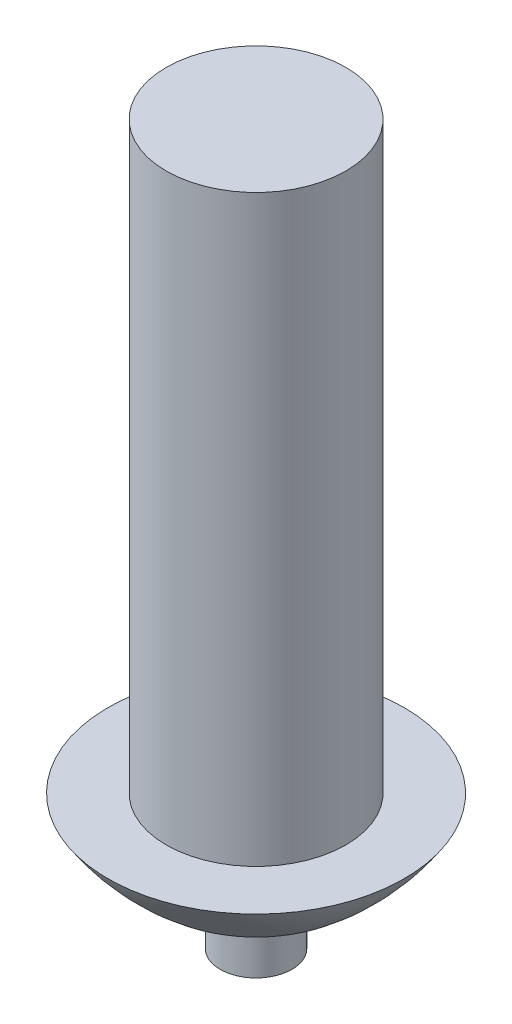
ISO-10303-21;
HEADER;
FILE_DESCRIPTION(('STEP AP214'),'2;1');
FILE_NAME('part.step','',(''),(''),'','','');
FILE_SCHEMA(('AUTOMOTIVE_DESIGN { 1 0 10303 214 1 1 1 1 }'));
ENDSEC;
DATA;
#1=APPLICATION_CONTEXT('core data for automotive mechanical design processes');
#2=APPLICATION_PROTOCOL_DEFINITION('international standard','automotive_design',2000,#1);
#3=PRODUCT_CONTEXT('',#1,'mechanical');
#4=PRODUCT('Part','Part','',(#3));
#5=PRODUCT_RELATED_PRODUCT_CATEGORY('part','',(#4));
#6=PRODUCT_DEFINITION_FORMATION('','',#4);
#7=PRODUCT_DEFINITION_CONTEXT('part definition',#1,'design');
#8=PRODUCT_DEFINITION('design','',#6,#7);
#9=PRODUCT_DEFINITION_SHAPE('','',#8);
#10=(LENGTH_UNIT() NAMED_UNIT(*) SI_UNIT(.MILLI.,.METRE.));
#11=(NAMED_UNIT(*) PLANE_ANGLE_UNIT() SI_UNIT($,.RADIAN.));
#12=(NAMED_UNIT(*) SI_UNIT($,.STERADIAN.) SOLID_ANGLE_UNIT());
#13=UNCERTAINTY_MEASURE_WITH_UNIT(LENGTH_MEASURE(1.E-05),#10,'distance_accuracy_value','');
#14=(GEOMETRIC_REPRESENTATION_CONTEXT(3) GLOBAL_UNCERTAINTY_ASSIGNED_CONTEXT((#13)) GLOBAL_UNIT_ASSIGNED_CONTEXT((#10,
#11,#12)) REPRESENTATION_CONTEXT('',''));
#15=CARTESIAN_POINT('',(0.,0.,0.));
#16=DIRECTION('',(0.,0.,1.));
#17=DIRECTION('',(1.,0.,0.));
#18=AXIS2_PLACEMENT_3D('',#15,#16,#17);
#19=CARTESIAN_POINT('',(0.,6.5,0.));
#20=DIRECTION('',(0.,1.,0.));
#21=DIRECTION('',(0.,0.,1.));
#22=AXIS2_PLACEMENT_3D('',#19,#20,#21);
#23=PLANE('',#22);
#24=CARTESIAN_POINT('',(0.,6.5,0.));
#25=DIRECTION('',(0.,-1.,0.));
#26=DIRECTION('',(0.,0.,-1.));
#27=AXIS2_PLACEMENT_3D('',#24,#25,#26);
#28=CIRCLE('',#27,1.);
#29=CARTESIAN_POINT('',(0.,6.5,-1.));
#30=VERTEX_POINT('',#29);
#31=EDGE_CURVE('E10',#30,#30,#28,.T.);
#32=ORIENTED_EDGE('',*,*,#31,.F.);
#33=EDGE_LOOP('',(#32));
#34=FACE_BOUND('',#33,.T.);
#35=ADVANCED_FACE('F31',(#34),#23,.T.);
#36=CARTESIAN_POINT('',(0.,0.,0.));
#37=DIRECTION('',(0.,-1.,0.));
#38=DIRECTION('',(0.,0.,-1.));
#39=AXIS2_PLACEMENT_3D('',#36,#37,#38);
#40=CYLINDRICAL_SURFACE('',#39,1.);
#41=ORIENTED_EDGE('',*,*,#31,.T.);
#42=EDGE_LOOP('',(#41));
#43=FACE_BOUND('',#42,.T.);
#44=CARTESIAN_POINT('',(0.,0.,0.));
#45=DIRECTION('',(0.,-1.,0.));
#46=DIRECTION('',(0.,0.,-1.));
#47=AXIS2_PLACEMENT_3D('',#44,#45,#46);
#48=CIRCLE('',#47,1.);
#49=CARTESIAN_POINT('',(0.,0.,-1.));
#50=VERTEX_POINT('',#49);
#51=EDGE_CURVE('E37',#50,#50,#48,.T.);
#52=ORIENTED_EDGE('',*,*,#51,.F.);
#53=EDGE_LOOP('',(#52));
#54=FACE_BOUND('',#53,.T.);
#55=ADVANCED_FACE('F70',(#43,#54),#40,.T.);
#56=CARTESIAN_POINT('',(0.,0.,-1.));
#57=DIRECTION('',(0.,1.,0.));
#58=DIRECTION('',(0.,0.,1.));
#59=AXIS2_PLACEMENT_3D('',#56,#57,#58);
#60=PLANE('',#59);
#61=ORIENTED_EDGE('',*,*,#51,.T.);
#62=EDGE_LOOP('',(#61));
#63=FACE_BOUND('',#62,.T.);
#64=CARTESIAN_POINT('',(0.,0.,0.));
#65=DIRECTION('',(0.,-1.,0.));
#66=DIRECTION('',(0.,0.,-1.));
#67=AXIS2_PLACEMENT_3D('',#64,#65,#66);
#68=CIRCLE('',#67,1.65);
#69=CARTESIAN_POINT('',(0.,0.,-1.65));
#70=VERTEX_POINT('',#69);
#71=EDGE_CURVE('E41',#70,#70,#68,.T.);
#72=ORIENTED_EDGE('',*,*,#71,.F.);
#73=EDGE_LOOP('',(#72));
#74=FACE_BOUND('',#73,.T.);
#75=ADVANCED_FACE('F66',(#63,#74),#60,.T.);
#76=CARTESIAN_POINT('',(0.,1.3494189924828,0.));
#77=DIRECTION('',(0.,-1.,0.));
#78=DIRECTION('',(0.,0.,-1.));
#79=AXIS2_PLACEMENT_3D('',#76,#77,#78);
#80=DEGENERATE_TOROIDAL_SURFACE('',#79,0.45453519398624,2.5,.F.);
#81=ORIENTED_EDGE('',*,*,#71,.T.);
#82=EDGE_LOOP('',(#81));
#83=FACE_BOUND('',#82,.T.);
#84=CARTESIAN_POINT('',(0.,-1.,0.));
#85=DIRECTION('',(0.,-1.,0.));
#86=DIRECTION('',(0.,0.,-1.));
#87=AXIS2_PLACEMENT_3D('',#84,#85,#86);
#88=CIRCLE('',#87,0.4);
#89=CARTESIAN_POINT('',(0.,-1.,-0.4));
#90=VERTEX_POINT('',#89);
#91=EDGE_CURVE('E45',#90,#90,#88,.T.);
#92=ORIENTED_EDGE('',*,*,#91,.F.);
#93=EDGE_LOOP('',(#92));
#94=FACE_BOUND('',#93,.T.);
#95=ADVANCED_FACE('F58',(#83,#94),#80,.F.);
#96=CARTESIAN_POINT('',(0.,0.,0.));
#97=DIRECTION('',(0.,-1.,0.));
#98=DIRECTION('',(0.,0.,-1.));
#99=AXIS2_PLACEMENT_3D('',#96,#97,#98);
#100=CYLINDRICAL_SURFACE('',#99,0.4);
#101=ORIENTED_EDGE('',*,*,#91,.T.);
#102=EDGE_LOOP('',(#101));
#103=FACE_BOUND('',#102,.T.);
#104=CARTESIAN_POINT('',(0.,-1.5,0.));
#105=DIRECTION('',(0.,-1.,0.));
#106=DIRECTION('',(0.,0.,-1.));
#107=AXIS2_PLACEMENT_3D('',#104,#105,#106);
#108=CIRCLE('',#107,0.4);
#109=CARTESIAN_POINT('',(0.,-1.5,-0.4));
#110=VERTEX_POINT('',#109);
#111=EDGE_CURVE('E50',#110,#110,#108,.T.);
#112=ORIENTED_EDGE('',*,*,#111,.F.);
#113=EDGE_LOOP('',(#112));
#114=FACE_BOUND('',#113,.T.);
#115=ADVANCED_FACE('F56',(#103,#114),#100,.T.);
#116=CARTESIAN_POINT('',(0.,-1.5,0.));
#117=DIRECTION('',(0.,-1.,0.));
#118=DIRECTION('',(0.,0.,-1.));
#119=AXIS2_PLACEMENT_3D('',#116,#117,#118);
#120=PLANE('',#119);
#121=ORIENTED_EDGE('',*,*,#111,.T.);
#122=EDGE_LOOP('',(#121));
#123=FACE_BOUND('',#122,.T.);
#124=ADVANCED_FACE('F54',(#123),#120,.T.);
#125=CLOSED_SHELL('',(#35,#55,#75,#95,#115,#124));
#126=MANIFOLD_SOLID_BREP('B2',#125);
#127=ADVANCED_BREP_SHAPE_REPRESENTATION('',(#18,#126),#14);
#128=SHAPE_DEFINITION_REPRESENTATION(#9,#127);
ENDSEC;
END-ISO-10303-21;
